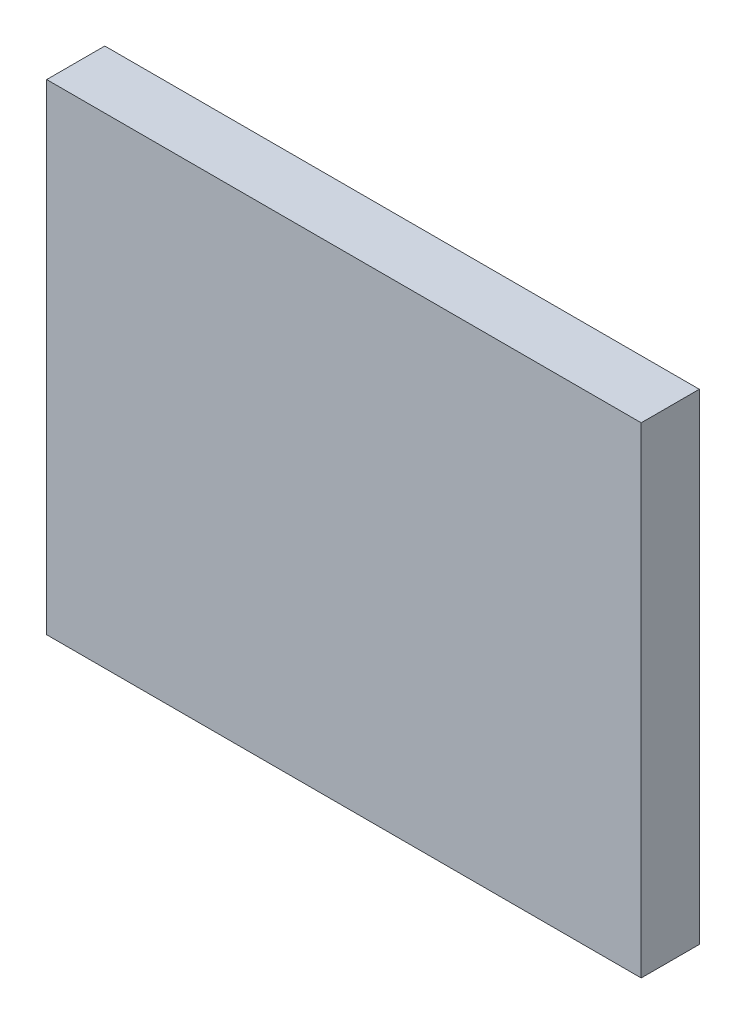
ISO-10303-21;
HEADER;
FILE_DESCRIPTION(('STEP AP214'),'2;1');
FILE_NAME('part.step','',(''),(''),'','','');
FILE_SCHEMA(('AUTOMOTIVE_DESIGN { 1 0 10303 214 1 1 1 1 }'));
ENDSEC;
DATA;
#1=APPLICATION_CONTEXT('core data for automotive mechanical design processes');
#2=APPLICATION_PROTOCOL_DEFINITION('international standard','automotive_design',2000,#1);
#3=PRODUCT_CONTEXT('',#1,'mechanical');
#4=PRODUCT('Part','Part','',(#3));
#5=PRODUCT_RELATED_PRODUCT_CATEGORY('part','',(#4));
#6=PRODUCT_DEFINITION_FORMATION('','',#4);
#7=PRODUCT_DEFINITION_CONTEXT('part definition',#1,'design');
#8=PRODUCT_DEFINITION('design','',#6,#7);
#9=PRODUCT_DEFINITION_SHAPE('','',#8);
#10=(LENGTH_UNIT() NAMED_UNIT(*) SI_UNIT(.MILLI.,.METRE.));
#11=(NAMED_UNIT(*) PLANE_ANGLE_UNIT() SI_UNIT($,.RADIAN.));
#12=(NAMED_UNIT(*) SI_UNIT($,.STERADIAN.) SOLID_ANGLE_UNIT());
#13=UNCERTAINTY_MEASURE_WITH_UNIT(LENGTH_MEASURE(1.E-05),#10,'distance_accuracy_value','');
#14=(GEOMETRIC_REPRESENTATION_CONTEXT(3) GLOBAL_UNCERTAINTY_ASSIGNED_CONTEXT((#13)) GLOBAL_UNIT_ASSIGNED_CONTEXT((#10,
#11,#12)) REPRESENTATION_CONTEXT('',''));
#15=CARTESIAN_POINT('',(0.,0.,0.));
#16=DIRECTION('',(0.,0.,1.));
#17=DIRECTION('',(1.,0.,0.));
#18=AXIS2_PLACEMENT_3D('',#15,#16,#17);
#19=CARTESIAN_POINT('',(-77.0987632822409,37.6069636964598,10.));
#20=DIRECTION('',(1.,0.,0.));
#21=DIRECTION('',(0.,0.,-1.));
#22=AXIS2_PLACEMENT_3D('',#19,#20,#21);
#23=PLANE('',#22);
#24=DIRECTION('',(0.,-1.,0.));
#25=VECTOR('',#24,1.);
#26=CARTESIAN_POINT('',(-77.0987632822409,37.6069636964598,0.));
#27=LINE('',#26,#25);
#28=CARTESIAN_POINT('',(-77.0987632822409,37.6069636964598,0.));
#29=VERTEX_POINT('',#28);
#30=CARTESIAN_POINT('',(-77.0987632822409,-45.1463072537452,0.));
#31=VERTEX_POINT('',#30);
#32=EDGE_CURVE('E96',#29,#31,#27,.T.);
#33=ORIENTED_EDGE('',*,*,#32,.T.);
#34=DIRECTION('',(0.,0.,-1.));
#35=VECTOR('',#34,1.);
#36=CARTESIAN_POINT('',(-77.0987632822409,-45.1463072537452,10.));
#37=LINE('',#36,#35);
#38=CARTESIAN_POINT('',(-77.0987632822409,-45.1463072537452,10.));
#39=VERTEX_POINT('',#38);
#40=EDGE_CURVE('E11',#39,#31,#37,.T.);
#41=ORIENTED_EDGE('',*,*,#40,.F.);
#42=DIRECTION('',(0.,-1.,0.));
#43=VECTOR('',#42,1.);
#44=CARTESIAN_POINT('',(-77.0987632822409,37.6069636964598,10.));
#45=LINE('',#44,#43);
#46=CARTESIAN_POINT('',(-77.0987632822409,37.6069636964598,10.));
#47=VERTEX_POINT('',#46);
#48=EDGE_CURVE('E84',#47,#39,#45,.T.);
#49=ORIENTED_EDGE('',*,*,#48,.F.);
#50=DIRECTION('',(0.,0.,-1.));
#51=VECTOR('',#50,1.);
#52=CARTESIAN_POINT('',(-77.0987632822409,37.6069636964598,10.));
#53=LINE('',#52,#51);
#54=EDGE_CURVE('E92',#47,#29,#53,.T.);
#55=ORIENTED_EDGE('',*,*,#54,.T.);
#56=EDGE_LOOP('',(#33,#41,#49,#55));
#57=FACE_BOUND('',#56,.T.);
#58=ADVANCED_FACE('F33',(#57),#23,.F.);
#59=CARTESIAN_POINT('',(-77.0987632822409,-45.1463072537452,10.));
#60=DIRECTION('',(0.,1.,0.));
#61=DIRECTION('',(0.,0.,1.));
#62=AXIS2_PLACEMENT_3D('',#59,#60,#61);
#63=PLANE('',#62);
#64=DIRECTION('',(1.,0.,0.));
#65=VECTOR('',#64,1.);
#66=CARTESIAN_POINT('',(-77.0987632822409,-45.1463072537452,0.));
#67=LINE('',#66,#65);
#68=CARTESIAN_POINT('',(25.2208992809193,-45.1463072537452,0.));
#69=VERTEX_POINT('',#68);
#70=EDGE_CURVE('E88',#31,#69,#67,.T.);
#71=ORIENTED_EDGE('',*,*,#70,.T.);
#72=DIRECTION('',(0.,0.,-1.));
#73=VECTOR('',#72,1.);
#74=CARTESIAN_POINT('',(25.2208992809193,-45.1463072537452,10.));
#75=LINE('',#74,#73);
#76=CARTESIAN_POINT('',(25.2208992809193,-45.1463072537452,10.));
#77=VERTEX_POINT('',#76);
#78=EDGE_CURVE('E41',#77,#69,#75,.T.);
#79=ORIENTED_EDGE('',*,*,#78,.F.);
#80=DIRECTION('',(1.,0.,0.));
#81=VECTOR('',#80,1.);
#82=CARTESIAN_POINT('',(-77.0987632822409,-45.1463072537452,10.));
#83=LINE('',#82,#81);
#84=EDGE_CURVE('E79',#39,#77,#83,.T.);
#85=ORIENTED_EDGE('',*,*,#84,.F.);
#86=ORIENTED_EDGE('',*,*,#40,.T.);
#87=EDGE_LOOP('',(#71,#79,#85,#86));
#88=FACE_BOUND('',#87,.T.);
#89=ADVANCED_FACE('F87',(#88),#63,.F.);
#90=CARTESIAN_POINT('',(25.2208992809193,37.6069636964598,10.));
#91=DIRECTION('',(-1.,0.,0.));
#92=DIRECTION('',(0.,0.,1.));
#93=AXIS2_PLACEMENT_3D('',#90,#91,#92);
#94=PLANE('',#93);
#95=DIRECTION('',(0.,1.,0.));
#96=VECTOR('',#95,1.);
#97=CARTESIAN_POINT('',(25.2208992809193,37.6069636964598,0.));
#98=LINE('',#97,#96);
#99=CARTESIAN_POINT('',(25.2208992809193,37.6069636964598,0.));
#100=VERTEX_POINT('',#99);
#101=EDGE_CURVE('E66',#69,#100,#98,.T.);
#102=ORIENTED_EDGE('',*,*,#101,.T.);
#103=DIRECTION('',(0.,0.,-1.));
#104=VECTOR('',#103,1.);
#105=CARTESIAN_POINT('',(25.2208992809193,37.6069636964598,10.));
#106=LINE('',#105,#104);
#107=CARTESIAN_POINT('',(25.2208992809193,37.6069636964598,10.));
#108=VERTEX_POINT('',#107);
#109=EDGE_CURVE('E89',#108,#100,#106,.T.);
#110=ORIENTED_EDGE('',*,*,#109,.F.);
#111=DIRECTION('',(0.,1.,0.));
#112=VECTOR('',#111,1.);
#113=CARTESIAN_POINT('',(25.2208992809193,37.6069636964598,10.));
#114=LINE('',#113,#112);
#115=EDGE_CURVE('E82',#77,#108,#114,.T.);
#116=ORIENTED_EDGE('',*,*,#115,.F.);
#117=ORIENTED_EDGE('',*,*,#78,.T.);
#118=EDGE_LOOP('',(#102,#110,#116,#117));
#119=FACE_BOUND('',#118,.T.);
#120=ADVANCED_FACE('F90',(#119),#94,.F.);
#121=CARTESIAN_POINT('',(-77.0987632822409,37.6069636964598,10.));
#122=DIRECTION('',(0.,-1.,0.));
#123=DIRECTION('',(0.,0.,-1.));
#124=AXIS2_PLACEMENT_3D('',#121,#122,#123);
#125=PLANE('',#124);
#126=DIRECTION('',(-1.,0.,0.));
#127=VECTOR('',#126,1.);
#128=CARTESIAN_POINT('',(-77.0987632822409,37.6069636964598,0.));
#129=LINE('',#128,#127);
#130=EDGE_CURVE('E72',#100,#29,#129,.T.);
#131=ORIENTED_EDGE('',*,*,#130,.T.);
#132=ORIENTED_EDGE('',*,*,#54,.F.);
#133=DIRECTION('',(-1.,0.,0.));
#134=VECTOR('',#133,1.);
#135=CARTESIAN_POINT('',(-77.0987632822409,37.6069636964598,10.));
#136=LINE('',#135,#134);
#137=EDGE_CURVE('E49',#108,#47,#136,.T.);
#138=ORIENTED_EDGE('',*,*,#137,.F.);
#139=ORIENTED_EDGE('',*,*,#109,.T.);
#140=EDGE_LOOP('',(#131,#132,#138,#139));
#141=FACE_BOUND('',#140,.T.);
#142=ADVANCED_FACE('F103',(#141),#125,.F.);
#143=CARTESIAN_POINT('',(0.,0.,10.));
#144=DIRECTION('',(0.,0.,1.));
#145=DIRECTION('',(1.,0.,0.));
#146=AXIS2_PLACEMENT_3D('',#143,#144,#145);
#147=PLANE('',#146);
#148=ORIENTED_EDGE('',*,*,#48,.T.);
#149=ORIENTED_EDGE('',*,*,#84,.T.);
#150=ORIENTED_EDGE('',*,*,#115,.T.);
#151=ORIENTED_EDGE('',*,*,#137,.T.);
#152=EDGE_LOOP('',(#148,#149,#150,#151));
#153=FACE_BOUND('',#152,.T.);
#154=ADVANCED_FACE('F80',(#153),#147,.T.);
#155=CARTESIAN_POINT('',(0.,0.,0.));
#156=DIRECTION('',(0.,0.,1.));
#157=DIRECTION('',(1.,0.,0.));
#158=AXIS2_PLACEMENT_3D('',#155,#156,#157);
#159=PLANE('',#158);
#160=ORIENTED_EDGE('',*,*,#32,.F.);
#161=ORIENTED_EDGE('',*,*,#130,.F.);
#162=ORIENTED_EDGE('',*,*,#101,.F.);
#163=ORIENTED_EDGE('',*,*,#70,.F.);
#164=EDGE_LOOP('',(#160,#161,#162,#163));
#165=FACE_BOUND('',#164,.T.);
#166=ADVANCED_FACE('F106',(#165),#159,.F.);
#167=CLOSED_SHELL('',(#58,#89,#120,#142,#154,#166));
#168=MANIFOLD_SOLID_BREP('B2',#167);
#169=ADVANCED_BREP_SHAPE_REPRESENTATION('',(#18,#168),#14);
#170=SHAPE_DEFINITION_REPRESENTATION(#9,#169);
ENDSEC;
END-ISO-10303-21;
